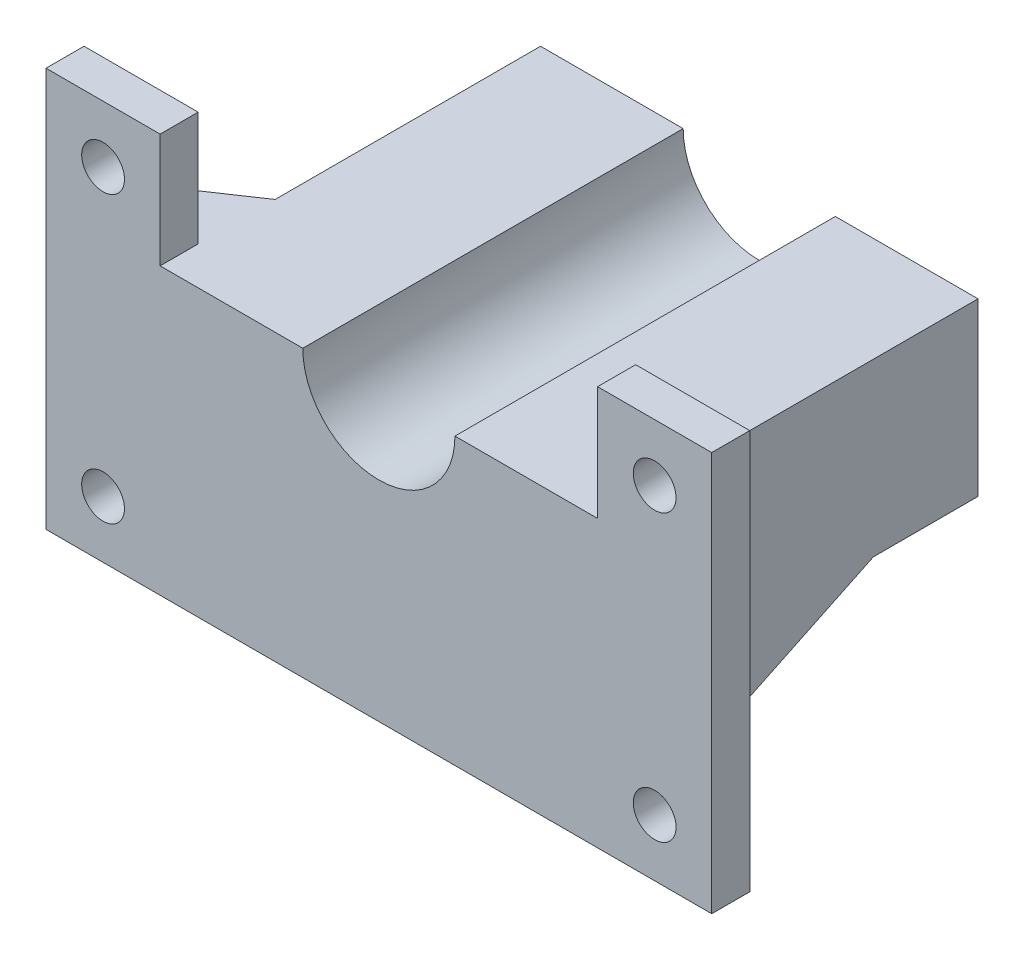
ISO-10303-21;
HEADER;
FILE_DESCRIPTION(('STEP AP214'),'2;1');
FILE_NAME('part.step','',(''),(''),'','','');
FILE_SCHEMA(('AUTOMOTIVE_DESIGN { 1 0 10303 214 1 1 1 1 }'));
ENDSEC;
DATA;
#1=APPLICATION_CONTEXT('core data for automotive mechanical design processes');
#2=APPLICATION_PROTOCOL_DEFINITION('international standard','automotive_design',2000,#1);
#3=PRODUCT_CONTEXT('',#1,'mechanical');
#4=PRODUCT('Part','Part','',(#3));
#5=PRODUCT_RELATED_PRODUCT_CATEGORY('part','',(#4));
#6=PRODUCT_DEFINITION_FORMATION('','',#4);
#7=PRODUCT_DEFINITION_CONTEXT('part definition',#1,'design');
#8=PRODUCT_DEFINITION('design','',#6,#7);
#9=PRODUCT_DEFINITION_SHAPE('','',#8);
#10=(LENGTH_UNIT() NAMED_UNIT(*) SI_UNIT(.MILLI.,.METRE.));
#11=(NAMED_UNIT(*) PLANE_ANGLE_UNIT() SI_UNIT($,.RADIAN.));
#12=(NAMED_UNIT(*) SI_UNIT($,.STERADIAN.) SOLID_ANGLE_UNIT());
#13=UNCERTAINTY_MEASURE_WITH_UNIT(LENGTH_MEASURE(1.E-05),#10,'distance_accuracy_value','');
#14=(GEOMETRIC_REPRESENTATION_CONTEXT(3) GLOBAL_UNCERTAINTY_ASSIGNED_CONTEXT((#13)) GLOBAL_UNIT_ASSIGNED_CONTEXT((#10,
#11,#12)) REPRESENTATION_CONTEXT('',''));
#15=CARTESIAN_POINT('',(0.,0.,0.));
#16=DIRECTION('',(0.,0.,1.));
#17=DIRECTION('',(1.,0.,0.));
#18=AXIS2_PLACEMENT_3D('',#15,#16,#17);
#19=CARTESIAN_POINT('',(0.,0.,0.));
#20=DIRECTION('',(0.,0.,1.));
#21=DIRECTION('',(1.,0.,0.));
#22=AXIS2_PLACEMENT_3D('',#19,#20,#21);
#23=PLANE('',#22);
#24=CARTESIAN_POINT('',(29.,24.,0.));
#25=DIRECTION('',(0.,0.,-1.));
#26=DIRECTION('',(-1.,0.,0.));
#27=AXIS2_PLACEMENT_3D('',#24,#25,#26);
#28=CIRCLE('',#27,2.24999999999999);
#29=CARTESIAN_POINT('',(26.75,24.,0.));
#30=VERTEX_POINT('',#29);
#31=EDGE_CURVE('E208',#30,#30,#28,.T.);
#32=ORIENTED_EDGE('',*,*,#31,.F.);
#33=EDGE_LOOP('',(#32));
#34=FACE_BOUND('',#33,.T.);
#35=DIRECTION('',(0.,1.,0.));
#36=VECTOR('',#35,1.);
#37=CARTESIAN_POINT('',(35.,0.,0.));
#38=LINE('',#37,#36);
#39=CARTESIAN_POINT('',(35.,18.,0.));
#40=VERTEX_POINT('',#39);
#41=CARTESIAN_POINT('',(35.,30.,0.));
#42=VERTEX_POINT('',#41);
#43=EDGE_CURVE('E292',#40,#42,#38,.T.);
#44=ORIENTED_EDGE('',*,*,#43,.F.);
#45=DIRECTION('',(-1.,0.,0.));
#46=VECTOR('',#45,1.);
#47=CARTESIAN_POINT('',(0.,18.,0.));
#48=LINE('',#47,#46);
#49=CARTESIAN_POINT('',(23.,18.,0.));
#50=VERTEX_POINT('',#49);
#51=EDGE_CURVE('E334',#40,#50,#48,.T.);
#52=ORIENTED_EDGE('',*,*,#51,.T.);
#53=DIRECTION('',(0.,-1.,0.));
#54=VECTOR('',#53,1.);
#55=CARTESIAN_POINT('',(23.,0.,0.));
#56=LINE('',#55,#54);
#57=CARTESIAN_POINT('',(23.,30.,0.));
#58=VERTEX_POINT('',#57);
#59=EDGE_CURVE('E248',#58,#50,#56,.T.);
#60=ORIENTED_EDGE('',*,*,#59,.F.);
#61=DIRECTION('',(-1.,0.,0.));
#62=VECTOR('',#61,1.);
#63=CARTESIAN_POINT('',(0.,30.,0.));
#64=LINE('',#63,#62);
#65=EDGE_CURVE('E261',#42,#58,#64,.T.);
#66=ORIENTED_EDGE('',*,*,#65,.F.);
#67=EDGE_LOOP('',(#44,#52,#60,#66));
#68=FACE_BOUND('',#67,.T.);
#69=ADVANCED_FACE('F40',(#34,#68),#23,.F.);
#70=CARTESIAN_POINT('',(-29.,24.,0.));
#71=DIRECTION('',(0.,0.,-1.));
#72=DIRECTION('',(-1.,0.,0.));
#73=AXIS2_PLACEMENT_3D('',#70,#71,#72);
#74=CIRCLE('',#73,2.24999999999999);
#75=CARTESIAN_POINT('',(-31.25,24.,0.));
#76=VERTEX_POINT('',#75);
#77=EDGE_CURVE('E198',#76,#76,#74,.T.);
#78=ORIENTED_EDGE('',*,*,#77,.F.);
#79=EDGE_LOOP('',(#78));
#80=FACE_BOUND('',#79,.T.);
#81=DIRECTION('',(0.,1.,0.));
#82=VECTOR('',#81,1.);
#83=CARTESIAN_POINT('',(-23.,0.,0.));
#84=LINE('',#83,#82);
#85=CARTESIAN_POINT('',(-23.,18.,0.));
#86=VERTEX_POINT('',#85);
#87=CARTESIAN_POINT('',(-23.,30.,0.));
#88=VERTEX_POINT('',#87);
#89=EDGE_CURVE('E284',#86,#88,#84,.T.);
#90=ORIENTED_EDGE('',*,*,#89,.F.);
#91=DIRECTION('',(-1.,0.,0.));
#92=VECTOR('',#91,1.);
#93=CARTESIAN_POINT('',(0.,18.,0.));
#94=LINE('',#93,#92);
#95=CARTESIAN_POINT('',(-35.,18.,0.));
#96=VERTEX_POINT('',#95);
#97=EDGE_CURVE('E325',#86,#96,#94,.T.);
#98=ORIENTED_EDGE('',*,*,#97,.T.);
#99=DIRECTION('',(0.,-1.,0.));
#100=VECTOR('',#99,1.);
#101=CARTESIAN_POINT('',(-35.,0.,0.));
#102=LINE('',#101,#100);
#103=CARTESIAN_POINT('',(-35.,30.,0.));
#104=VERTEX_POINT('',#103);
#105=EDGE_CURVE('E289',#104,#96,#102,.T.);
#106=ORIENTED_EDGE('',*,*,#105,.F.);
#107=DIRECTION('',(-1.,0.,0.));
#108=VECTOR('',#107,1.);
#109=CARTESIAN_POINT('',(0.,30.,0.));
#110=LINE('',#109,#108);
#111=EDGE_CURVE('E286',#88,#104,#110,.T.);
#112=ORIENTED_EDGE('',*,*,#111,.F.);
#113=EDGE_LOOP('',(#90,#98,#106,#112));
#114=FACE_BOUND('',#113,.T.);
#115=ADVANCED_FACE('F403',(#80,#114),#23,.F.);
#116=CARTESIAN_POINT('',(23.,0.,4.));
#117=DIRECTION('',(1.,0.,0.));
#118=DIRECTION('',(0.,1.,0.));
#119=AXIS2_PLACEMENT_3D('',#116,#117,#118);
#120=PLANE('',#119);
#121=ORIENTED_EDGE('',*,*,#59,.T.);
#122=DIRECTION('',(0.,0.,-1.));
#123=VECTOR('',#122,1.);
#124=CARTESIAN_POINT('',(23.,18.,4.));
#125=LINE('',#124,#123);
#126=CARTESIAN_POINT('',(23.,18.,4.));
#127=VERTEX_POINT('',#126);
#128=EDGE_CURVE('E319',#127,#50,#125,.T.);
#129=ORIENTED_EDGE('',*,*,#128,.F.);
#130=DIRECTION('',(0.,-1.,0.));
#131=VECTOR('',#130,1.);
#132=CARTESIAN_POINT('',(23.,0.,4.));
#133=LINE('',#132,#131);
#134=CARTESIAN_POINT('',(23.,30.,4.));
#135=VERTEX_POINT('',#134);
#136=EDGE_CURVE('E257',#135,#127,#133,.T.);
#137=ORIENTED_EDGE('',*,*,#136,.F.);
#138=DIRECTION('',(0.,0.,-1.));
#139=VECTOR('',#138,1.);
#140=CARTESIAN_POINT('',(23.,30.,4.));
#141=LINE('',#140,#139);
#142=EDGE_CURVE('E281',#135,#58,#141,.T.);
#143=ORIENTED_EDGE('',*,*,#142,.T.);
#144=EDGE_LOOP('',(#121,#129,#137,#143));
#145=FACE_BOUND('',#144,.T.);
#146=ADVANCED_FACE('F405',(#145),#120,.F.);
#147=CARTESIAN_POINT('',(0.,18.,4.));
#148=DIRECTION('',(0.,-1.,0.));
#149=DIRECTION('',(0.,0.,-1.));
#150=AXIS2_PLACEMENT_3D('',#147,#148,#149);
#151=PLANE('',#150);
#152=ORIENTED_EDGE('',*,*,#128,.T.);
#153=ORIENTED_EDGE('',*,*,#51,.F.);
#154=DIRECTION('',(-0.829037572555045,0.,-0.559192903470742));
#155=VECTOR('',#154,1.);
#156=CARTESIAN_POINT('',(12.7987513034749,18.,-14.9749291282337));
#157=LINE('',#156,#155);
#158=CARTESIAN_POINT('',(23.,18.,-8.09409999999998));
#159=VERTEX_POINT('',#158);
#160=EDGE_CURVE('E182',#40,#159,#157,.T.);
#161=ORIENTED_EDGE('',*,*,#160,.T.);
#162=DIRECTION('',(0.,0.,1.));
#163=VECTOR('',#162,1.);
#164=CARTESIAN_POINT('',(23.,18.,-36.));
#165=LINE('',#164,#163);
#166=CARTESIAN_POINT('',(23.,18.,-36.));
#167=VERTEX_POINT('',#166);
#168=EDGE_CURVE('E245',#167,#159,#165,.T.);
#169=ORIENTED_EDGE('',*,*,#168,.F.);
#170=DIRECTION('',(-1.,0.,0.));
#171=VECTOR('',#170,1.);
#172=CARTESIAN_POINT('',(0.,18.,-36.));
#173=LINE('',#172,#171);
#174=CARTESIAN_POINT('',(8.,18.,-36.));
#175=VERTEX_POINT('',#174);
#176=EDGE_CURVE('E241',#167,#175,#173,.T.);
#177=ORIENTED_EDGE('',*,*,#176,.T.);
#178=DIRECTION('',(0.,0.,-1.));
#179=VECTOR('',#178,1.);
#180=CARTESIAN_POINT('',(8.,18.,4.));
#181=LINE('',#180,#179);
#182=CARTESIAN_POINT('',(8.,18.,4.));
#183=VERTEX_POINT('',#182);
#184=EDGE_CURVE('E317',#183,#175,#181,.T.);
#185=ORIENTED_EDGE('',*,*,#184,.F.);
#186=DIRECTION('',(-1.,0.,0.));
#187=VECTOR('',#186,1.);
#188=CARTESIAN_POINT('',(0.,18.,4.));
#189=LINE('',#188,#187);
#190=EDGE_CURVE('E260',#127,#183,#189,.T.);
#191=ORIENTED_EDGE('',*,*,#190,.F.);
#192=EDGE_LOOP('',(#152,#153,#161,#169,#177,#185,#191));
#193=FACE_BOUND('',#192,.T.);
#194=ADVANCED_FACE('F350',(#193),#151,.F.);
#195=CARTESIAN_POINT('',(0.,18.,4.));
#196=DIRECTION('',(0.,0.,-1.));
#197=DIRECTION('',(-1.,0.,0.));
#198=AXIS2_PLACEMENT_3D('',#195,#196,#197);
#199=CYLINDRICAL_SURFACE('',#198,8.);
#200=ORIENTED_EDGE('',*,*,#184,.T.);
#201=CARTESIAN_POINT('',(0.,18.,-36.));
#202=DIRECTION('',(0.,0.,1.));
#203=DIRECTION('',(1.,0.,0.));
#204=AXIS2_PLACEMENT_3D('',#201,#202,#203);
#205=CIRCLE('',#204,8.);
#206=CARTESIAN_POINT('',(-8.,18.,-36.));
#207=VERTEX_POINT('',#206);
#208=EDGE_CURVE('E226',#207,#175,#205,.T.);
#209=ORIENTED_EDGE('',*,*,#208,.F.);
#210=DIRECTION('',(0.,0.,-1.));
#211=VECTOR('',#210,1.);
#212=CARTESIAN_POINT('',(-8.,18.,4.));
#213=LINE('',#212,#211);
#214=CARTESIAN_POINT('',(-8.,18.,4.));
#215=VERTEX_POINT('',#214);
#216=EDGE_CURVE('E315',#215,#207,#213,.T.);
#217=ORIENTED_EDGE('',*,*,#216,.F.);
#218=CARTESIAN_POINT('',(0.,18.,4.));
#219=DIRECTION('',(0.,0.,1.));
#220=DIRECTION('',(1.,0.,0.));
#221=AXIS2_PLACEMENT_3D('',#218,#219,#220);
#222=CIRCLE('',#221,8.);
#223=EDGE_CURVE('E263',#215,#183,#222,.T.);
#224=ORIENTED_EDGE('',*,*,#223,.T.);
#225=EDGE_LOOP('',(#200,#209,#217,#224));
#226=FACE_BOUND('',#225,.T.);
#227=ADVANCED_FACE('F386',(#226),#199,.F.);
#228=CARTESIAN_POINT('',(0.,18.,4.));
#229=DIRECTION('',(0.,1.,0.));
#230=DIRECTION('',(0.,0.,1.));
#231=AXIS2_PLACEMENT_3D('',#228,#229,#230);
#232=PLANE('',#231);
#233=ORIENTED_EDGE('',*,*,#216,.T.);
#234=DIRECTION('',(1.,0.,0.));
#235=VECTOR('',#234,1.);
#236=CARTESIAN_POINT('',(0.,18.,-36.));
#237=LINE('',#236,#235);
#238=CARTESIAN_POINT('',(-23.,18.,-36.));
#239=VERTEX_POINT('',#238);
#240=EDGE_CURVE('E230',#239,#207,#237,.T.);
#241=ORIENTED_EDGE('',*,*,#240,.F.);
#242=DIRECTION('',(0.,0.,1.));
#243=VECTOR('',#242,1.);
#244=CARTESIAN_POINT('',(-23.,18.,-36.));
#245=LINE('',#244,#243);
#246=CARTESIAN_POINT('',(-23.,18.,-8.09409999999998));
#247=VERTEX_POINT('',#246);
#248=EDGE_CURVE('E244',#239,#247,#245,.T.);
#249=ORIENTED_EDGE('',*,*,#248,.T.);
#250=DIRECTION('',(0.829037572555045,0.,-0.559192903470742));
#251=VECTOR('',#250,1.);
#252=CARTESIAN_POINT('',(-23.,18.,-8.09409999999998));
#253=LINE('',#252,#251);
#254=EDGE_CURVE('E328',#247,#96,#253,.F.);
#255=ORIENTED_EDGE('',*,*,#254,.T.);
#256=ORIENTED_EDGE('',*,*,#97,.F.);
#257=DIRECTION('',(0.,0.,-1.));
#258=VECTOR('',#257,1.);
#259=CARTESIAN_POINT('',(-23.,18.,4.));
#260=LINE('',#259,#258);
#261=CARTESIAN_POINT('',(-23.,18.,4.));
#262=VERTEX_POINT('',#261);
#263=EDGE_CURVE('E312',#262,#86,#260,.T.);
#264=ORIENTED_EDGE('',*,*,#263,.F.);
#265=DIRECTION('',(1.,0.,0.));
#266=VECTOR('',#265,1.);
#267=CARTESIAN_POINT('',(0.,18.,4.));
#268=LINE('',#267,#266);
#269=EDGE_CURVE('E266',#262,#215,#268,.T.);
#270=ORIENTED_EDGE('',*,*,#269,.T.);
#271=EDGE_LOOP('',(#233,#241,#249,#255,#256,#264,#270));
#272=FACE_BOUND('',#271,.T.);
#273=ADVANCED_FACE('F391',(#272),#232,.T.);
#274=CARTESIAN_POINT('',(-23.,0.,4.));
#275=DIRECTION('',(-1.,0.,0.));
#276=DIRECTION('',(0.,-1.,0.));
#277=AXIS2_PLACEMENT_3D('',#274,#275,#276);
#278=PLANE('',#277);
#279=ORIENTED_EDGE('',*,*,#89,.T.);
#280=DIRECTION('',(0.,0.,-1.));
#281=VECTOR('',#280,1.);
#282=CARTESIAN_POINT('',(-23.,30.,4.));
#283=LINE('',#282,#281);
#284=CARTESIAN_POINT('',(-23.,30.,4.));
#285=VERTEX_POINT('',#284);
#286=EDGE_CURVE('E309',#285,#88,#283,.T.);
#287=ORIENTED_EDGE('',*,*,#286,.F.);
#288=DIRECTION('',(0.,1.,0.));
#289=VECTOR('',#288,1.);
#290=CARTESIAN_POINT('',(-23.,0.,4.));
#291=LINE('',#290,#289);
#292=EDGE_CURVE('E269',#262,#285,#291,.T.);
#293=ORIENTED_EDGE('',*,*,#292,.F.);
#294=ORIENTED_EDGE('',*,*,#263,.T.);
#295=EDGE_LOOP('',(#279,#287,#293,#294));
#296=FACE_BOUND('',#295,.T.);
#297=ADVANCED_FACE('F396',(#296),#278,.F.);
#298=CARTESIAN_POINT('',(0.,30.,4.));
#299=DIRECTION('',(0.,-1.,0.));
#300=DIRECTION('',(1.,0.,0.));
#301=AXIS2_PLACEMENT_3D('',#298,#299,#300);
#302=PLANE('',#301);
#303=ORIENTED_EDGE('',*,*,#111,.T.);
#304=DIRECTION('',(0.,0.,-1.));
#305=VECTOR('',#304,1.);
#306=CARTESIAN_POINT('',(-35.,30.,4.));
#307=LINE('',#306,#305);
#308=CARTESIAN_POINT('',(-35.,30.,4.));
#309=VERTEX_POINT('',#308);
#310=EDGE_CURVE('E306',#309,#104,#307,.T.);
#311=ORIENTED_EDGE('',*,*,#310,.F.);
#312=DIRECTION('',(-1.,0.,0.));
#313=VECTOR('',#312,1.);
#314=CARTESIAN_POINT('',(0.,30.,4.));
#315=LINE('',#314,#313);
#316=EDGE_CURVE('E271',#285,#309,#315,.T.);
#317=ORIENTED_EDGE('',*,*,#316,.F.);
#318=ORIENTED_EDGE('',*,*,#286,.T.);
#319=EDGE_LOOP('',(#303,#311,#317,#318));
#320=FACE_BOUND('',#319,.T.);
#321=ADVANCED_FACE('F400',(#320),#302,.F.);
#322=CARTESIAN_POINT('',(-35.,0.,4.));
#323=DIRECTION('',(1.,0.,0.));
#324=DIRECTION('',(0.,1.,0.));
#325=AXIS2_PLACEMENT_3D('',#322,#323,#324);
#326=PLANE('',#325);
#327=ORIENTED_EDGE('',*,*,#105,.T.);
#328=CARTESIAN_POINT('',(-34.9999967352391,-12.,0.));
#329=VERTEX_POINT('',#328);
#330=EDGE_CURVE('E288',#96,#329,#102,.T.);
#331=ORIENTED_EDGE('',*,*,#330,.T.);
#332=DIRECTION('',(0.,0.,-1.));
#333=VECTOR('',#332,1.);
#334=CARTESIAN_POINT('',(-35.,-12.,4.));
#335=LINE('',#334,#333);
#336=CARTESIAN_POINT('',(-35.,-12.,4.));
#337=VERTEX_POINT('',#336);
#338=EDGE_CURVE('E303',#337,#329,#335,.T.);
#339=ORIENTED_EDGE('',*,*,#338,.F.);
#340=DIRECTION('',(0.,-1.,0.));
#341=VECTOR('',#340,1.);
#342=CARTESIAN_POINT('',(-35.,0.,4.));
#343=LINE('',#342,#341);
#344=EDGE_CURVE('E273',#309,#337,#343,.T.);
#345=ORIENTED_EDGE('',*,*,#344,.F.);
#346=ORIENTED_EDGE('',*,*,#310,.T.);
#347=EDGE_LOOP('',(#327,#331,#339,#345,#346));
#348=FACE_BOUND('',#347,.T.);
#349=ADVANCED_FACE('F370',(#348),#326,.F.);
#350=CARTESIAN_POINT('',(0.,-12.,4.));
#351=DIRECTION('',(0.,1.,0.));
#352=DIRECTION('',(0.,0.,1.));
#353=AXIS2_PLACEMENT_3D('',#350,#351,#352);
#354=PLANE('',#353);
#355=ORIENTED_EDGE('',*,*,#338,.T.);
#356=DIRECTION('',(1.,0.,0.));
#357=VECTOR('',#356,1.);
#358=CARTESIAN_POINT('',(-23.,-12.,0.));
#359=LINE('',#358,#357);
#360=CARTESIAN_POINT('',(35.,-12.,0.));
#361=VERTEX_POINT('',#360);
#362=EDGE_CURVE('E221',#329,#361,#359,.T.);
#363=ORIENTED_EDGE('',*,*,#362,.T.);
#364=DIRECTION('',(0.,0.,-1.));
#365=VECTOR('',#364,1.);
#366=CARTESIAN_POINT('',(35.,-12.,4.));
#367=LINE('',#366,#365);
#368=CARTESIAN_POINT('',(35.,-12.,4.));
#369=VERTEX_POINT('',#368);
#370=EDGE_CURVE('E300',#369,#361,#367,.T.);
#371=ORIENTED_EDGE('',*,*,#370,.F.);
#372=DIRECTION('',(1.,0.,0.));
#373=VECTOR('',#372,1.);
#374=CARTESIAN_POINT('',(0.,-12.,4.));
#375=LINE('',#374,#373);
#376=EDGE_CURVE('E275',#337,#369,#375,.T.);
#377=ORIENTED_EDGE('',*,*,#376,.F.);
#378=EDGE_LOOP('',(#355,#363,#371,#377));
#379=FACE_BOUND('',#378,.T.);
#380=ADVANCED_FACE('F364',(#379),#354,.F.);
#381=CARTESIAN_POINT('',(35.,0.,4.));
#382=DIRECTION('',(-1.,0.,0.));
#383=DIRECTION('',(0.,-1.,0.));
#384=AXIS2_PLACEMENT_3D('',#381,#382,#383);
#385=PLANE('',#384);
#386=EDGE_CURVE('E181',#361,#40,#38,.T.);
#387=ORIENTED_EDGE('',*,*,#386,.T.);
#388=ORIENTED_EDGE('',*,*,#43,.T.);
#389=DIRECTION('',(0.,0.,-1.));
#390=VECTOR('',#389,1.);
#391=CARTESIAN_POINT('',(35.,30.,4.));
#392=LINE('',#391,#390);
#393=CARTESIAN_POINT('',(35.,30.,4.));
#394=VERTEX_POINT('',#393);
#395=EDGE_CURVE('E297',#394,#42,#392,.T.);
#396=ORIENTED_EDGE('',*,*,#395,.F.);
#397=DIRECTION('',(0.,1.,0.));
#398=VECTOR('',#397,1.);
#399=CARTESIAN_POINT('',(35.,0.,4.));
#400=LINE('',#399,#398);
#401=EDGE_CURVE('E277',#369,#394,#400,.T.);
#402=ORIENTED_EDGE('',*,*,#401,.F.);
#403=ORIENTED_EDGE('',*,*,#370,.T.);
#404=EDGE_LOOP('',(#387,#388,#396,#402,#403));
#405=FACE_BOUND('',#404,.T.);
#406=ADVANCED_FACE('F359',(#405),#385,.F.);
#407=CARTESIAN_POINT('',(0.,30.,4.));
#408=DIRECTION('',(0.,-1.,0.));
#409=DIRECTION('',(1.,0.,0.));
#410=AXIS2_PLACEMENT_3D('',#407,#408,#409);
#411=PLANE('',#410);
#412=ORIENTED_EDGE('',*,*,#65,.T.);
#413=ORIENTED_EDGE('',*,*,#142,.F.);
#414=DIRECTION('',(-1.,0.,0.));
#415=VECTOR('',#414,1.);
#416=CARTESIAN_POINT('',(0.,30.,4.));
#417=LINE('',#416,#415);
#418=EDGE_CURVE('E279',#394,#135,#417,.T.);
#419=ORIENTED_EDGE('',*,*,#418,.F.);
#420=ORIENTED_EDGE('',*,*,#395,.T.);
#421=EDGE_LOOP('',(#412,#413,#419,#420));
#422=FACE_BOUND('',#421,.T.);
#423=ADVANCED_FACE('F418',(#422),#411,.F.);
#424=CARTESIAN_POINT('',(0.,0.,4.));
#425=DIRECTION('',(0.,0.,1.));
#426=DIRECTION('',(1.,0.,0.));
#427=AXIS2_PLACEMENT_3D('',#424,#425,#426);
#428=PLANE('',#427);
#429=CARTESIAN_POINT('',(29.,24.,4.));
#430=DIRECTION('',(0.,0.,1.));
#431=DIRECTION('',(1.,0.,0.));
#432=AXIS2_PLACEMENT_3D('',#429,#430,#431);
#433=CIRCLE('',#432,2.24999999999998);
#434=CARTESIAN_POINT('',(31.25,24.,4.));
#435=VERTEX_POINT('',#434);
#436=EDGE_CURVE('E45',#435,#435,#433,.T.);
#437=ORIENTED_EDGE('',*,*,#436,.F.);
#438=EDGE_LOOP('',(#437));
#439=FACE_BOUND('',#438,.T.);
#440=CARTESIAN_POINT('',(-29.,24.,4.));
#441=DIRECTION('',(0.,0.,1.));
#442=DIRECTION('',(1.,0.,0.));
#443=AXIS2_PLACEMENT_3D('',#440,#441,#442);
#444=CIRCLE('',#443,2.24999999999998);
#445=CARTESIAN_POINT('',(-26.75,24.,4.));
#446=VERTEX_POINT('',#445);
#447=EDGE_CURVE('E195',#446,#446,#444,.T.);
#448=ORIENTED_EDGE('',*,*,#447,.F.);
#449=EDGE_LOOP('',(#448));
#450=FACE_BOUND('',#449,.T.);
#451=CARTESIAN_POINT('',(29.,-6.,4.));
#452=DIRECTION('',(0.,0.,1.));
#453=DIRECTION('',(1.,0.,0.));
#454=AXIS2_PLACEMENT_3D('',#451,#452,#453);
#455=CIRCLE('',#454,2.24999999999999);
#456=CARTESIAN_POINT('',(31.25,-6.,4.));
#457=VERTEX_POINT('',#456);
#458=EDGE_CURVE('E176',#457,#457,#455,.T.);
#459=ORIENTED_EDGE('',*,*,#458,.F.);
#460=EDGE_LOOP('',(#459));
#461=FACE_BOUND('',#460,.T.);
#462=CARTESIAN_POINT('',(-28.9999983676195,-6.,4.));
#463=DIRECTION('',(0.,0.,1.));
#464=DIRECTION('',(1.,0.,0.));
#465=AXIS2_PLACEMENT_3D('',#462,#463,#464);
#466=CIRCLE('',#465,2.24999999999999);
#467=CARTESIAN_POINT('',(-26.7499983676196,-6.,4.));
#468=VERTEX_POINT('',#467);
#469=EDGE_CURVE('E189',#468,#468,#466,.T.);
#470=ORIENTED_EDGE('',*,*,#469,.F.);
#471=EDGE_LOOP('',(#470));
#472=FACE_BOUND('',#471,.T.);
#473=ORIENTED_EDGE('',*,*,#136,.T.);
#474=ORIENTED_EDGE('',*,*,#190,.T.);
#475=ORIENTED_EDGE('',*,*,#223,.F.);
#476=ORIENTED_EDGE('',*,*,#269,.F.);
#477=ORIENTED_EDGE('',*,*,#292,.T.);
#478=ORIENTED_EDGE('',*,*,#316,.T.);
#479=ORIENTED_EDGE('',*,*,#344,.T.);
#480=ORIENTED_EDGE('',*,*,#376,.T.);
#481=ORIENTED_EDGE('',*,*,#401,.T.);
#482=ORIENTED_EDGE('',*,*,#418,.T.);
#483=EDGE_LOOP('',(#473,#474,#475,#476,#477,#478,#479,#480,#481,#482));
#484=FACE_BOUND('',#483,.T.);
#485=ADVANCED_FACE('F390',(#439,#450,#461,#472,#484),#428,.T.);
#486=CARTESIAN_POINT('',(23.,0.,-36.));
#487=DIRECTION('',(1.,0.,0.));
#488=DIRECTION('',(0.,1.,0.));
#489=AXIS2_PLACEMENT_3D('',#486,#487,#488);
#490=PLANE('',#489);
#491=ORIENTED_EDGE('',*,*,#168,.T.);
#492=DIRECTION('',(0.,-1.,0.));
#493=VECTOR('',#492,1.);
#494=CARTESIAN_POINT('',(23.,0.,-8.09409999999998));
#495=LINE('',#494,#493);
#496=CARTESIAN_POINT('',(23.,-8.114832,-8.09409999999998));
#497=VERTEX_POINT('',#496);
#498=EDGE_CURVE('E184',#159,#497,#495,.T.);
#499=ORIENTED_EDGE('',*,*,#498,.T.);
#500=DIRECTION('',(0.,0.432731067584771,-0.901523057468274));
#501=VECTOR('',#500,1.);
#502=CARTESIAN_POINT('',(23.,0.,-25.));
#503=LINE('',#502,#501);
#504=CARTESIAN_POINT('',(23.,0.,-25.));
#505=VERTEX_POINT('',#504);
#506=EDGE_CURVE('E191',#497,#505,#503,.T.);
#507=ORIENTED_EDGE('',*,*,#506,.T.);
#508=DIRECTION('',(0.,0.,1.));
#509=VECTOR('',#508,1.);
#510=CARTESIAN_POINT('',(23.,0.,-36.));
#511=LINE('',#510,#509);
#512=CARTESIAN_POINT('',(23.,0.,-36.));
#513=VERTEX_POINT('',#512);
#514=EDGE_CURVE('E249',#513,#505,#511,.T.);
#515=ORIENTED_EDGE('',*,*,#514,.F.);
#516=DIRECTION('',(0.,1.,0.));
#517=VECTOR('',#516,1.);
#518=CARTESIAN_POINT('',(23.,0.,-36.));
#519=LINE('',#518,#517);
#520=EDGE_CURVE('E238',#513,#167,#519,.T.);
#521=ORIENTED_EDGE('',*,*,#520,.T.);
#522=EDGE_LOOP('',(#491,#499,#507,#515,#521));
#523=FACE_BOUND('',#522,.T.);
#524=ADVANCED_FACE('F337',(#523),#490,.T.);
#525=CARTESIAN_POINT('',(0.,0.,-36.));
#526=DIRECTION('',(0.,-1.,0.));
#527=DIRECTION('',(0.,0.,-1.));
#528=AXIS2_PLACEMENT_3D('',#525,#526,#527);
#529=PLANE('',#528);
#530=DIRECTION('',(1.,0.,0.));
#531=VECTOR('',#530,1.);
#532=CARTESIAN_POINT('',(-23.,0.,-25.));
#533=LINE('',#532,#531);
#534=CARTESIAN_POINT('',(-23.,0.,-25.));
#535=VERTEX_POINT('',#534);
#536=EDGE_CURVE('E223',#535,#505,#533,.T.);
#537=ORIENTED_EDGE('',*,*,#536,.F.);
#538=DIRECTION('',(0.,0.,1.));
#539=VECTOR('',#538,1.);
#540=CARTESIAN_POINT('',(-23.,0.,-36.));
#541=LINE('',#540,#539);
#542=CARTESIAN_POINT('',(-23.,0.,-36.));
#543=VERTEX_POINT('',#542);
#544=EDGE_CURVE('E252',#543,#535,#541,.T.);
#545=ORIENTED_EDGE('',*,*,#544,.F.);
#546=DIRECTION('',(1.,0.,0.));
#547=VECTOR('',#546,1.);
#548=CARTESIAN_POINT('',(0.,0.,-36.));
#549=LINE('',#548,#547);
#550=EDGE_CURVE('E235',#543,#513,#549,.T.);
#551=ORIENTED_EDGE('',*,*,#550,.T.);
#552=ORIENTED_EDGE('',*,*,#514,.T.);
#553=EDGE_LOOP('',(#537,#545,#551,#552));
#554=FACE_BOUND('',#553,.T.);
#555=ADVANCED_FACE('F341',(#554),#529,.T.);
#556=CARTESIAN_POINT('',(-23.,0.,-36.));
#557=DIRECTION('',(1.,0.,0.));
#558=DIRECTION('',(0.,1.,0.));
#559=AXIS2_PLACEMENT_3D('',#556,#557,#558);
#560=PLANE('',#559);
#561=DIRECTION('',(0.,0.432731067584771,-0.901523057468274));
#562=VECTOR('',#561,1.);
#563=CARTESIAN_POINT('',(-23.,0.,-25.));
#564=LINE('',#563,#562);
#565=CARTESIAN_POINT('',(-23.,-8.114832,-8.09409999999998));
#566=VERTEX_POINT('',#565);
#567=EDGE_CURVE('E219',#566,#535,#564,.T.);
#568=ORIENTED_EDGE('',*,*,#567,.F.);
#569=DIRECTION('',(0.,1.,0.));
#570=VECTOR('',#569,1.);
#571=CARTESIAN_POINT('',(-23.,18.,-8.09409999999998));
#572=LINE('',#571,#570);
#573=EDGE_CURVE('E322',#566,#247,#572,.T.);
#574=ORIENTED_EDGE('',*,*,#573,.T.);
#575=ORIENTED_EDGE('',*,*,#248,.F.);
#576=DIRECTION('',(0.,1.,0.));
#577=VECTOR('',#576,1.);
#578=CARTESIAN_POINT('',(-23.,0.,-36.));
#579=LINE('',#578,#577);
#580=EDGE_CURVE('E233',#543,#239,#579,.T.);
#581=ORIENTED_EDGE('',*,*,#580,.F.);
#582=ORIENTED_EDGE('',*,*,#544,.T.);
#583=EDGE_LOOP('',(#568,#574,#575,#581,#582));
#584=FACE_BOUND('',#583,.T.);
#585=ADVANCED_FACE('F380',(#584),#560,.F.);
#586=CARTESIAN_POINT('',(0.,0.,-36.));
#587=DIRECTION('',(0.,0.,1.));
#588=DIRECTION('',(1.,0.,0.));
#589=AXIS2_PLACEMENT_3D('',#586,#587,#588);
#590=PLANE('',#589);
#591=ORIENTED_EDGE('',*,*,#208,.T.);
#592=ORIENTED_EDGE('',*,*,#176,.F.);
#593=ORIENTED_EDGE('',*,*,#520,.F.);
#594=ORIENTED_EDGE('',*,*,#550,.F.);
#595=ORIENTED_EDGE('',*,*,#580,.T.);
#596=ORIENTED_EDGE('',*,*,#240,.T.);
#597=EDGE_LOOP('',(#591,#592,#593,#594,#595,#596));
#598=FACE_BOUND('',#597,.T.);
#599=ADVANCED_FACE('F346',(#598),#590,.F.);
#600=CARTESIAN_POINT('',(-23.,0.,-25.));
#601=DIRECTION('',(0.,-0.901523057468274,-0.432731067584771));
#602=DIRECTION('',(0.,0.432731067584771,-0.901523057468274));
#603=AXIS2_PLACEMENT_3D('',#600,#601,#602);
#604=PLANE('',#603);
#605=CARTESIAN_POINT('',(29.,-6.,-12.5));
#606=DIRECTION('',(0.,-0.901523057468274,-0.432731067584771));
#607=DIRECTION('',(0.,0.432731067584771,-0.901523057468274));
#608=AXIS2_PLACEMENT_3D('',#605,#606,#607);
#609=ELLIPSE('',#608,9.24361641590802,4.);
#610=CARTESIAN_POINT('',(28.8084914202801,-9.99541292783282,-4.17622306701494));
#611=VERTEX_POINT('',#610);
#612=CARTESIAN_POINT('',(26.813488674847,-9.34950268323186,-5.5218694099336));
#613=VERTEX_POINT('',#612);
#614=EDGE_CURVE('E57',#611,#613,#609,.T.);
#615=ORIENTED_EDGE('',*,*,#614,.F.);
#616=DIRECTION('',(0.800695966589822,-0.25923659945578,0.540076248866207));
#617=VECTOR('',#616,1.);
#618=CARTESIAN_POINT('',(32.5091603403186,-11.1935566260312,-1.68009036243491));
#619=LINE('',#618,#617);
#620=EDGE_CURVE('E172',#611,#361,#619,.T.);
#621=ORIENTED_EDGE('',*,*,#620,.T.);
#622=ORIENTED_EDGE('',*,*,#362,.F.);
#623=DIRECTION('',(-0.800695966589822,-0.25923659945578,0.540076248866207));
#624=VECTOR('',#623,1.);
#625=CARTESIAN_POINT('',(-21.3156067596446,-7.56948595856087,-9.23023758633151));
#626=LINE('',#625,#624);
#627=CARTESIAN_POINT('',(-28.8084917039418,-9.9954130196723,-4.17622287568268));
#628=VERTEX_POINT('',#627);
#629=EDGE_CURVE('E331',#329,#628,#626,.F.);
#630=ORIENTED_EDGE('',*,*,#629,.T.);
#631=CARTESIAN_POINT('',(-28.9999983676195,-6.,-12.5));
#632=DIRECTION('',(0.,-0.901523057468274,-0.432731067584771));
#633=DIRECTION('',(0.,0.432731067584771,-0.901523057468274));
#634=AXIS2_PLACEMENT_3D('',#631,#632,#633);
#635=ELLIPSE('',#634,9.24361641590802,3.99999999999999);
#636=CARTESIAN_POINT('',(-26.8134854361776,-9.34950163466704,-5.52187159444366));
#637=VERTEX_POINT('',#636);
#638=EDGE_CURVE('E63',#637,#628,#635,.T.);
#639=ORIENTED_EDGE('',*,*,#638,.F.);
#640=EDGE_CURVE('E330',#637,#566,#626,.F.);
#641=ORIENTED_EDGE('',*,*,#640,.T.);
#642=ORIENTED_EDGE('',*,*,#567,.T.);
#643=ORIENTED_EDGE('',*,*,#536,.T.);
#644=ORIENTED_EDGE('',*,*,#506,.F.);
#645=EDGE_CURVE('E175',#497,#613,#619,.T.);
#646=ORIENTED_EDGE('',*,*,#645,.T.);
#647=EDGE_LOOP('',(#615,#621,#622,#630,#639,#641,#642,#643,#644,#646));
#648=FACE_BOUND('',#647,.T.);
#649=ADVANCED_FACE('F171',(#648),#604,.T.);
#650=CARTESIAN_POINT('',(-23.,0.,-8.09409999999998));
#651=DIRECTION('',(-0.559192903470742,0.,-0.829037572555045));
#652=DIRECTION('',(0.,-1.,0.));
#653=AXIS2_PLACEMENT_3D('',#650,#651,#652);
#654=PLANE('',#653);
#655=ORIENTED_EDGE('',*,*,#640,.F.);
#656=CARTESIAN_POINT('',(-28.9999983676195,-6.,-4.04704999999999));
#657=DIRECTION('',(-0.559192903470742,0.,-0.829037572555045));
#658=DIRECTION('',(0.829037572555045,0.,-0.559192903470742));
#659=AXIS2_PLACEMENT_3D('',#656,#657,#658);
#660=ELLIPSE('',#659,4.8248717940156,3.99999999999999);
#661=EDGE_CURVE('E50',#637,#628,#660,.F.);
#662=ORIENTED_EDGE('',*,*,#661,.T.);
#663=ORIENTED_EDGE('',*,*,#629,.F.);
#664=ORIENTED_EDGE('',*,*,#330,.F.);
#665=ORIENTED_EDGE('',*,*,#254,.F.);
#666=ORIENTED_EDGE('',*,*,#573,.F.);
#667=EDGE_LOOP('',(#655,#662,#663,#664,#665,#666));
#668=FACE_BOUND('',#667,.T.);
#669=ADVANCED_FACE('F375',(#668),#654,.T.);
#670=CARTESIAN_POINT('',(34.9999967352391,0.,0.));
#671=DIRECTION('',(-0.559192903470742,0.,0.829037572555045));
#672=DIRECTION('',(0.,1.,0.));
#673=AXIS2_PLACEMENT_3D('',#670,#671,#672);
#674=PLANE('',#673);
#675=ORIENTED_EDGE('',*,*,#620,.F.);
#676=CARTESIAN_POINT('',(29.,-6.,-4.04704889894547));
#677=DIRECTION('',(-0.559192903470742,0.,0.829037572555045));
#678=DIRECTION('',(-0.829037572555045,0.,-0.559192903470742));
#679=AXIS2_PLACEMENT_3D('',#676,#677,#678);
#680=ELLIPSE('',#679,4.8248717940156,4.);
#681=EDGE_CURVE('E11',#611,#613,#680,.T.);
#682=ORIENTED_EDGE('',*,*,#681,.T.);
#683=ORIENTED_EDGE('',*,*,#645,.F.);
#684=ORIENTED_EDGE('',*,*,#498,.F.);
#685=ORIENTED_EDGE('',*,*,#160,.F.);
#686=ORIENTED_EDGE('',*,*,#386,.F.);
#687=EDGE_LOOP('',(#675,#682,#683,#684,#685,#686));
#688=FACE_BOUND('',#687,.T.);
#689=ADVANCED_FACE('F43',(#688),#674,.F.);
#690=CARTESIAN_POINT('',(-28.9999983676195,-6.,-36.));
#691=DIRECTION('',(0.,0.,-1.));
#692=DIRECTION('',(-1.,0.,0.));
#693=AXIS2_PLACEMENT_3D('',#690,#691,#692);
#694=CYLINDRICAL_SURFACE('',#693,2.24999999999999);
#695=ORIENTED_EDGE('',*,*,#469,.T.);
#696=EDGE_LOOP('',(#695));
#697=FACE_BOUND('',#696,.T.);
#698=CARTESIAN_POINT('',(-28.9999983676195,-6.,-0.399999999999998));
#699=DIRECTION('',(0.,0.,-1.));
#700=DIRECTION('',(-1.,0.,0.));
#701=AXIS2_PLACEMENT_3D('',#698,#699,#700);
#702=CIRCLE('',#701,2.25);
#703=CARTESIAN_POINT('',(-31.2499983676195,-6.,-0.399999999999998));
#704=VERTEX_POINT('',#703);
#705=EDGE_CURVE('E215',#704,#704,#702,.T.);
#706=ORIENTED_EDGE('',*,*,#705,.T.);
#707=EDGE_LOOP('',(#706));
#708=FACE_BOUND('',#707,.T.);
#709=ADVANCED_FACE('F445',(#697,#708),#694,.F.);
#710=CARTESIAN_POINT('',(-26.7499983676196,-6.,-0.399999999999998));
#711=DIRECTION('',(0.,0.,1.));
#712=DIRECTION('',(1.,0.,0.));
#713=AXIS2_PLACEMENT_3D('',#710,#711,#712);
#714=PLANE('',#713);
#715=ORIENTED_EDGE('',*,*,#705,.F.);
#716=EDGE_LOOP('',(#715));
#717=FACE_BOUND('',#716,.T.);
#718=CARTESIAN_POINT('',(-28.9999983676195,-6.,-0.399999999999998));
#719=DIRECTION('',(0.,0.,-1.));
#720=DIRECTION('',(-1.,0.,0.));
#721=AXIS2_PLACEMENT_3D('',#718,#719,#720);
#722=CIRCLE('',#721,3.99999999999999);
#723=CARTESIAN_POINT('',(-32.9999983676195,-6.,-0.399999999999998));
#724=VERTEX_POINT('',#723);
#725=EDGE_CURVE('E194',#724,#724,#722,.T.);
#726=ORIENTED_EDGE('',*,*,#725,.T.);
#727=EDGE_LOOP('',(#726));
#728=FACE_BOUND('',#727,.T.);
#729=ADVANCED_FACE('F551',(#717,#728),#714,.F.);
#730=CARTESIAN_POINT('',(-28.9999983676195,-6.,-36.));
#731=DIRECTION('',(0.,0.,-1.));
#732=DIRECTION('',(-1.,0.,0.));
#733=AXIS2_PLACEMENT_3D('',#730,#731,#732);
#734=CYLINDRICAL_SURFACE('',#733,3.99999999999999);
#735=ORIENTED_EDGE('',*,*,#638,.T.);
#736=ORIENTED_EDGE('',*,*,#661,.F.);
#737=EDGE_LOOP('',(#735,#736));
#738=FACE_BOUND('',#737,.T.);
#739=ORIENTED_EDGE('',*,*,#725,.F.);
#740=EDGE_LOOP('',(#739));
#741=FACE_BOUND('',#740,.T.);
#742=ADVANCED_FACE('F377',(#738,#741),#734,.F.);
#743=CARTESIAN_POINT('',(29.,-6.,-36.));
#744=DIRECTION('',(0.,0.,-1.));
#745=DIRECTION('',(-1.,0.,0.));
#746=AXIS2_PLACEMENT_3D('',#743,#744,#745);
#747=CYLINDRICAL_SURFACE('',#746,2.24999999999999);
#748=ORIENTED_EDGE('',*,*,#458,.T.);
#749=EDGE_LOOP('',(#748));
#750=FACE_BOUND('',#749,.T.);
#751=CARTESIAN_POINT('',(29.,-6.,-0.399999999999998));
#752=DIRECTION('',(0.,0.,-1.));
#753=DIRECTION('',(-1.,0.,0.));
#754=AXIS2_PLACEMENT_3D('',#751,#752,#753);
#755=CIRCLE('',#754,2.25);
#756=CARTESIAN_POINT('',(26.75,-6.,-0.399999999999998));
#757=VERTEX_POINT('',#756);
#758=EDGE_CURVE('E177',#757,#757,#755,.T.);
#759=ORIENTED_EDGE('',*,*,#758,.T.);
#760=EDGE_LOOP('',(#759));
#761=FACE_BOUND('',#760,.T.);
#762=ADVANCED_FACE('F570',(#750,#761),#747,.F.);
#763=CARTESIAN_POINT('',(31.25,-6.,-0.399999999999998));
#764=DIRECTION('',(0.,0.,1.));
#765=DIRECTION('',(1.,0.,0.));
#766=AXIS2_PLACEMENT_3D('',#763,#764,#765);
#767=PLANE('',#766);
#768=ORIENTED_EDGE('',*,*,#758,.F.);
#769=EDGE_LOOP('',(#768));
#770=FACE_BOUND('',#769,.T.);
#771=CARTESIAN_POINT('',(29.,-6.,-0.399999999999998));
#772=DIRECTION('',(0.,0.,-1.));
#773=DIRECTION('',(-1.,0.,0.));
#774=AXIS2_PLACEMENT_3D('',#771,#772,#773);
#775=CIRCLE('',#774,3.99999999999999);
#776=CARTESIAN_POINT('',(25.,-6.,-0.399999999999998));
#777=VERTEX_POINT('',#776);
#778=EDGE_CURVE('E197',#777,#777,#775,.T.);
#779=ORIENTED_EDGE('',*,*,#778,.T.);
#780=EDGE_LOOP('',(#779));
#781=FACE_BOUND('',#780,.T.);
#782=ADVANCED_FACE('F580',(#770,#781),#767,.F.);
#783=CARTESIAN_POINT('',(29.,-6.,-36.));
#784=DIRECTION('',(0.,0.,-1.));
#785=DIRECTION('',(-1.,0.,0.));
#786=AXIS2_PLACEMENT_3D('',#783,#784,#785);
#787=CYLINDRICAL_SURFACE('',#786,4.);
#788=ORIENTED_EDGE('',*,*,#614,.T.);
#789=ORIENTED_EDGE('',*,*,#681,.F.);
#790=EDGE_LOOP('',(#788,#789));
#791=FACE_BOUND('',#790,.T.);
#792=ORIENTED_EDGE('',*,*,#778,.F.);
#793=EDGE_LOOP('',(#792));
#794=FACE_BOUND('',#793,.T.);
#795=ADVANCED_FACE('F164',(#791,#794),#787,.F.);
#796=CARTESIAN_POINT('',(-29.,24.,0.));
#797=DIRECTION('',(0.,0.,-1.));
#798=DIRECTION('',(-1.,0.,0.));
#799=AXIS2_PLACEMENT_3D('',#796,#797,#798);
#800=CYLINDRICAL_SURFACE('',#799,2.24999999999998);
#801=ORIENTED_EDGE('',*,*,#447,.T.);
#802=EDGE_LOOP('',(#801));
#803=FACE_BOUND('',#802,.T.);
#804=ORIENTED_EDGE('',*,*,#77,.T.);
#805=EDGE_LOOP('',(#804));
#806=FACE_BOUND('',#805,.T.);
#807=ADVANCED_FACE('F601',(#803,#806),#800,.F.);
#808=CARTESIAN_POINT('',(29.,24.,0.));
#809=DIRECTION('',(0.,0.,-1.));
#810=DIRECTION('',(-1.,0.,0.));
#811=AXIS2_PLACEMENT_3D('',#808,#809,#810);
#812=CYLINDRICAL_SURFACE('',#811,2.24999999999998);
#813=ORIENTED_EDGE('',*,*,#436,.T.);
#814=EDGE_LOOP('',(#813));
#815=FACE_BOUND('',#814,.T.);
#816=ORIENTED_EDGE('',*,*,#31,.T.);
#817=EDGE_LOOP('',(#816));
#818=FACE_BOUND('',#817,.T.);
#819=ADVANCED_FACE('F651',(#815,#818),#812,.F.);
#820=CLOSED_SHELL('',(#69,#115,#146,#194,#227,#273,#297,#321,#349,#380,#406,#423,#485,#524,#555,
#585,#599,#649,#669,#689,#709,#729,#742,#762,#782,#795,#807,#819));
#821=MANIFOLD_SOLID_BREP('B2',#820);
#822=ADVANCED_BREP_SHAPE_REPRESENTATION('',(#18,#821),#14);
#823=SHAPE_DEFINITION_REPRESENTATION(#9,#822);
ENDSEC;
END-ISO-10303-21;
